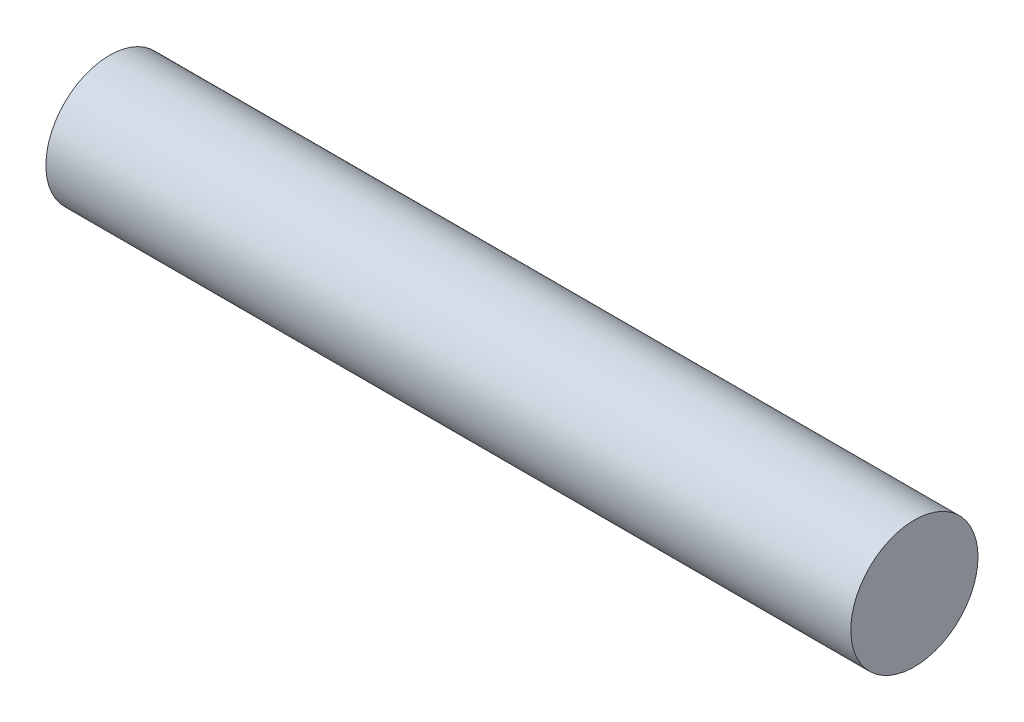
ISO-10303-21;
HEADER;
FILE_DESCRIPTION(('STEP AP214'),'2;1');
FILE_NAME('part.step','',(''),(''),'','','');
FILE_SCHEMA(('AUTOMOTIVE_DESIGN { 1 0 10303 214 1 1 1 1 }'));
ENDSEC;
DATA;
#1=APPLICATION_CONTEXT('core data for automotive mechanical design processes');
#2=APPLICATION_PROTOCOL_DEFINITION('international standard','automotive_design',2000,#1);
#3=PRODUCT_CONTEXT('',#1,'mechanical');
#4=PRODUCT('Part','Part','',(#3));
#5=PRODUCT_RELATED_PRODUCT_CATEGORY('part','',(#4));
#6=PRODUCT_DEFINITION_FORMATION('','',#4);
#7=PRODUCT_DEFINITION_CONTEXT('part definition',#1,'design');
#8=PRODUCT_DEFINITION('design','',#6,#7);
#9=PRODUCT_DEFINITION_SHAPE('','',#8);
#10=(LENGTH_UNIT() NAMED_UNIT(*) SI_UNIT(.MILLI.,.METRE.));
#11=(NAMED_UNIT(*) PLANE_ANGLE_UNIT() SI_UNIT($,.RADIAN.));
#12=(NAMED_UNIT(*) SI_UNIT($,.STERADIAN.) SOLID_ANGLE_UNIT());
#13=UNCERTAINTY_MEASURE_WITH_UNIT(LENGTH_MEASURE(1.E-05),#10,'distance_accuracy_value','');
#14=(GEOMETRIC_REPRESENTATION_CONTEXT(3) GLOBAL_UNCERTAINTY_ASSIGNED_CONTEXT((#13)) GLOBAL_UNIT_ASSIGNED_CONTEXT((#10,
#11,#12)) REPRESENTATION_CONTEXT('',''));
#15=CARTESIAN_POINT('',(0.,0.,0.));
#16=DIRECTION('',(0.,0.,1.));
#17=DIRECTION('',(1.,0.,0.));
#18=AXIS2_PLACEMENT_3D('',#15,#16,#17);
#19=CARTESIAN_POINT('',(76.,-0.133618280453718,-0.267236560907491));
#20=DIRECTION('',(-1.,0.,0.));
#21=DIRECTION('',(0.,0.,1.));
#22=AXIS2_PLACEMENT_3D('',#19,#20,#21);
#23=CYLINDRICAL_SURFACE('',#22,6.00539479470318);
#24=CARTESIAN_POINT('',(76.,-0.133618280453718,-0.267236560907491));
#25=DIRECTION('',(1.,0.,0.));
#26=DIRECTION('',(0.,0.,-1.));
#27=AXIS2_PLACEMENT_3D('',#24,#25,#26);
#28=CIRCLE('',#27,6.00539479470318);
#29=CARTESIAN_POINT('',(76.,-0.133618280453718,-6.27263135561068));
#30=VERTEX_POINT('',#29);
#31=EDGE_CURVE('E10',#30,#30,#28,.T.);
#32=ORIENTED_EDGE('',*,*,#31,.F.);
#33=EDGE_LOOP('',(#32));
#34=FACE_BOUND('',#33,.T.);
#35=CARTESIAN_POINT('',(0.,-0.133618280453718,-0.267236560907491));
#36=DIRECTION('',(1.,0.,0.));
#37=DIRECTION('',(0.,0.,-1.));
#38=AXIS2_PLACEMENT_3D('',#35,#36,#37);
#39=CIRCLE('',#38,6.00539479470318);
#40=CARTESIAN_POINT('',(0.,-0.133618280453718,-6.27263135561068));
#41=VERTEX_POINT('',#40);
#42=EDGE_CURVE('E40',#41,#41,#39,.T.);
#43=ORIENTED_EDGE('',*,*,#42,.T.);
#44=EDGE_LOOP('',(#43));
#45=FACE_BOUND('',#44,.T.);
#46=ADVANCED_FACE('F37',(#34,#45),#23,.T.);
#47=CARTESIAN_POINT('',(76.,-0.133618280453718,-0.267236560907491));
#48=DIRECTION('',(1.,0.,0.));
#49=DIRECTION('',(0.,0.,-1.));
#50=AXIS2_PLACEMENT_3D('',#47,#48,#49);
#51=PLANE('',#50);
#52=ORIENTED_EDGE('',*,*,#31,.T.);
#53=EDGE_LOOP('',(#52));
#54=FACE_BOUND('',#53,.T.);
#55=ADVANCED_FACE('F54',(#54),#51,.T.);
#56=CARTESIAN_POINT('',(0.,-0.133618280453718,-0.267236560907491));
#57=DIRECTION('',(1.,0.,0.));
#58=DIRECTION('',(0.,0.,-1.));
#59=AXIS2_PLACEMENT_3D('',#56,#57,#58);
#60=PLANE('',#59);
#61=ORIENTED_EDGE('',*,*,#42,.F.);
#62=EDGE_LOOP('',(#61));
#63=FACE_BOUND('',#62,.T.);
#64=ADVANCED_FACE('F52',(#63),#60,.F.);
#65=CLOSED_SHELL('',(#46,#55,#64));
#66=MANIFOLD_SOLID_BREP('B2',#65);
#67=ADVANCED_BREP_SHAPE_REPRESENTATION('',(#18,#66),#14);
#68=SHAPE_DEFINITION_REPRESENTATION(#9,#67);
ENDSEC;
END-ISO-10303-21;
